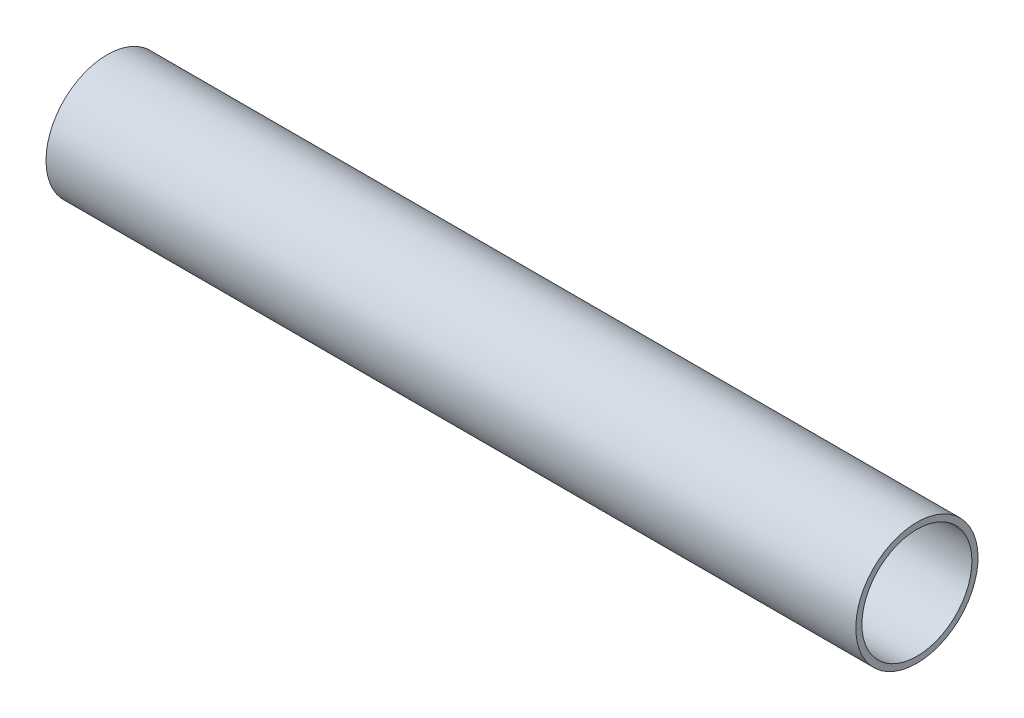
ISO-10303-21;
HEADER;
FILE_DESCRIPTION(('STEP AP214'),'2;1');
FILE_NAME('part.step','',(''),(''),'','','');
FILE_SCHEMA(('AUTOMOTIVE_DESIGN { 1 0 10303 214 1 1 1 1 }'));
ENDSEC;
DATA;
#1=APPLICATION_CONTEXT('core data for automotive mechanical design processes');
#2=APPLICATION_PROTOCOL_DEFINITION('international standard','automotive_design',2000,#1);
#3=PRODUCT_CONTEXT('',#1,'mechanical');
#4=PRODUCT('Part','Part','',(#3));
#5=PRODUCT_RELATED_PRODUCT_CATEGORY('part','',(#4));
#6=PRODUCT_DEFINITION_FORMATION('','',#4);
#7=PRODUCT_DEFINITION_CONTEXT('part definition',#1,'design');
#8=PRODUCT_DEFINITION('design','',#6,#7);
#9=PRODUCT_DEFINITION_SHAPE('','',#8);
#10=(LENGTH_UNIT() NAMED_UNIT(*) SI_UNIT(.MILLI.,.METRE.));
#11=(NAMED_UNIT(*) PLANE_ANGLE_UNIT() SI_UNIT($,.RADIAN.));
#12=(NAMED_UNIT(*) SI_UNIT($,.STERADIAN.) SOLID_ANGLE_UNIT());
#13=UNCERTAINTY_MEASURE_WITH_UNIT(LENGTH_MEASURE(1.E-05),#10,'distance_accuracy_value','');
#14=(GEOMETRIC_REPRESENTATION_CONTEXT(3) GLOBAL_UNCERTAINTY_ASSIGNED_CONTEXT((#13)) GLOBAL_UNIT_ASSIGNED_CONTEXT((#10,
#11,#12)) REPRESENTATION_CONTEXT('',''));
#15=CARTESIAN_POINT('',(0.,0.,0.));
#16=DIRECTION('',(0.,0.,1.));
#17=DIRECTION('',(1.,0.,0.));
#18=AXIS2_PLACEMENT_3D('',#15,#16,#17);
#19=CARTESIAN_POINT('',(167.4495,0.,0.));
#20=DIRECTION('',(-1.,0.,0.));
#21=DIRECTION('',(0.,0.,1.));
#22=AXIS2_PLACEMENT_3D('',#19,#20,#21);
#23=CYLINDRICAL_SURFACE('',#22,14.2875);
#24=CARTESIAN_POINT('',(-105.17450009,0.,0.));
#25=DIRECTION('',(1.,0.,0.));
#26=DIRECTION('',(0.,1.,0.));
#27=AXIS2_PLACEMENT_3D('',#24,#25,#26);
#28=CIRCLE('',#27,14.2875);
#29=CARTESIAN_POINT('',(-105.17450009,14.2875,0.));
#30=VERTEX_POINT('',#29);
#31=EDGE_CURVE('E49',#30,#30,#28,.T.);
#32=ORIENTED_EDGE('',*,*,#31,.F.);
#33=EDGE_LOOP('',(#32));
#34=FACE_BOUND('',#33,.T.);
#35=CARTESIAN_POINT('',(105.17450009,0.,0.));
#36=DIRECTION('',(-1.,0.,0.));
#37=DIRECTION('',(0.,-1.,0.));
#38=AXIS2_PLACEMENT_3D('',#35,#36,#37);
#39=CIRCLE('',#38,14.2875);
#40=CARTESIAN_POINT('',(105.17450009,-14.2875,0.));
#41=VERTEX_POINT('',#40);
#42=EDGE_CURVE('E51',#41,#41,#39,.T.);
#43=ORIENTED_EDGE('',*,*,#42,.F.);
#44=EDGE_LOOP('',(#43));
#45=FACE_BOUND('',#44,.T.);
#46=ADVANCED_FACE('F36',(#34,#45),#23,.F.);
#47=CARTESIAN_POINT('',(105.17450009,-15.875,-15.875));
#48=DIRECTION('',(-1.,0.,0.));
#49=DIRECTION('',(0.,-1.,0.));
#50=AXIS2_PLACEMENT_3D('',#47,#48,#49);
#51=PLANE('',#50);
#52=ORIENTED_EDGE('',*,*,#42,.T.);
#53=EDGE_LOOP('',(#52));
#54=FACE_BOUND('',#53,.T.);
#55=CARTESIAN_POINT('',(105.17450009,0.,0.));
#56=DIRECTION('',(-1.,0.,0.));
#57=DIRECTION('',(0.,-1.,0.));
#58=AXIS2_PLACEMENT_3D('',#55,#56,#57);
#59=CIRCLE('',#58,15.875);
#60=CARTESIAN_POINT('',(105.17450009,-15.875,0.));
#61=VERTEX_POINT('',#60);
#62=EDGE_CURVE('E39',#61,#61,#59,.T.);
#63=ORIENTED_EDGE('',*,*,#62,.F.);
#64=EDGE_LOOP('',(#63));
#65=FACE_BOUND('',#64,.T.);
#66=ADVANCED_FACE('F65',(#54,#65),#51,.F.);
#67=CARTESIAN_POINT('',(-105.17450009,-15.875,-15.875));
#68=DIRECTION('',(1.,0.,0.));
#69=DIRECTION('',(0.,1.,0.));
#70=AXIS2_PLACEMENT_3D('',#67,#68,#69);
#71=PLANE('',#70);
#72=ORIENTED_EDGE('',*,*,#31,.T.);
#73=EDGE_LOOP('',(#72));
#74=FACE_BOUND('',#73,.T.);
#75=CARTESIAN_POINT('',(-105.17450009,0.,0.));
#76=DIRECTION('',(1.,0.,0.));
#77=DIRECTION('',(0.,1.,0.));
#78=AXIS2_PLACEMENT_3D('',#75,#76,#77);
#79=CIRCLE('',#78,15.875);
#80=CARTESIAN_POINT('',(-105.17450009,15.875,0.));
#81=VERTEX_POINT('',#80);
#82=EDGE_CURVE('E10',#81,#81,#79,.T.);
#83=ORIENTED_EDGE('',*,*,#82,.F.);
#84=EDGE_LOOP('',(#83));
#85=FACE_BOUND('',#84,.T.);
#86=ADVANCED_FACE('F60',(#74,#85),#71,.F.);
#87=CARTESIAN_POINT('',(167.4495,0.,0.));
#88=DIRECTION('',(-1.,0.,0.));
#89=DIRECTION('',(0.,0.,1.));
#90=AXIS2_PLACEMENT_3D('',#87,#88,#89);
#91=CYLINDRICAL_SURFACE('',#90,15.875);
#92=ORIENTED_EDGE('',*,*,#62,.T.);
#93=EDGE_LOOP('',(#92));
#94=FACE_BOUND('',#93,.T.);
#95=ORIENTED_EDGE('',*,*,#82,.T.);
#96=EDGE_LOOP('',(#95));
#97=FACE_BOUND('',#96,.T.);
#98=ADVANCED_FACE('F73',(#94,#97),#91,.T.);
#99=CLOSED_SHELL('',(#46,#66,#86,#98));
#100=MANIFOLD_SOLID_BREP('B2',#99);
#101=ADVANCED_BREP_SHAPE_REPRESENTATION('',(#18,#100),#14);
#102=SHAPE_DEFINITION_REPRESENTATION(#9,#101);
ENDSEC;
END-ISO-10303-21;
